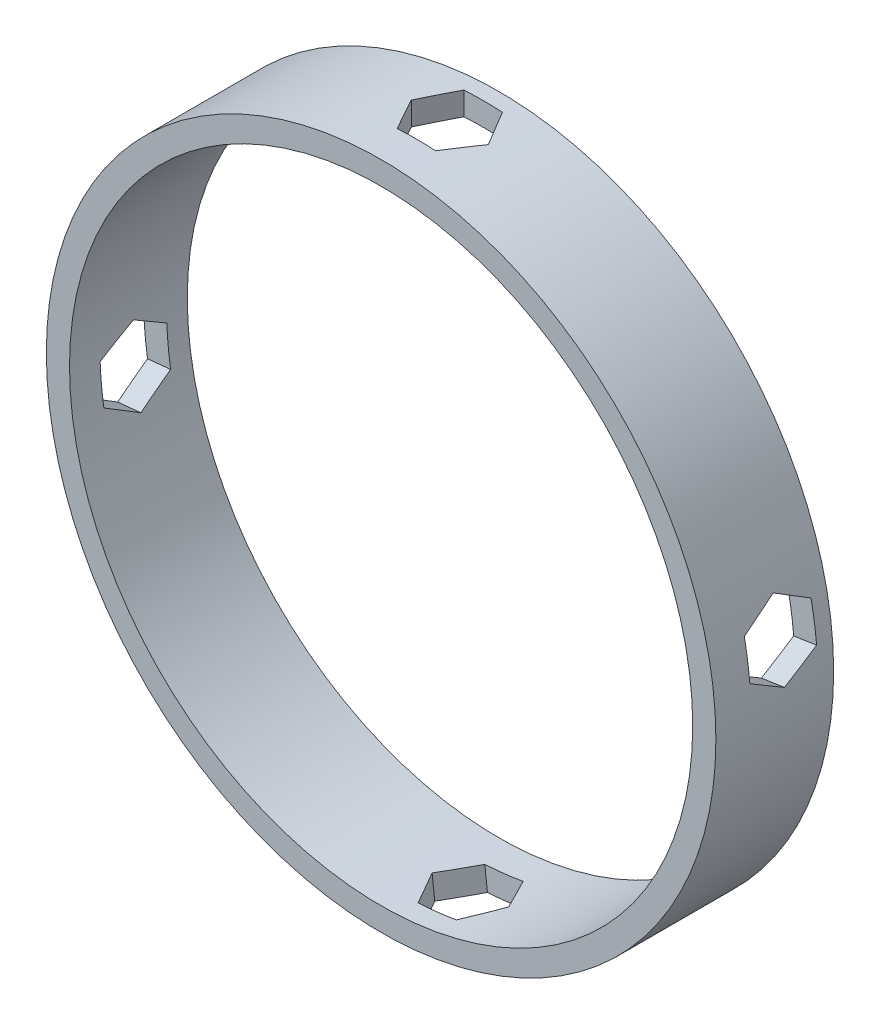
ISO-10303-21;
HEADER;
FILE_DESCRIPTION(('STEP AP214'),'2;1');
FILE_NAME('part.step','',(''),(''),'','','');
FILE_SCHEMA(('AUTOMOTIVE_DESIGN { 1 0 10303 214 1 1 1 1 }'));
ENDSEC;
DATA;
#1=APPLICATION_CONTEXT('core data for automotive mechanical design processes');
#2=APPLICATION_PROTOCOL_DEFINITION('international standard','automotive_design',2000,#1);
#3=PRODUCT_CONTEXT('',#1,'mechanical');
#4=PRODUCT('Part','Part','',(#3));
#5=PRODUCT_RELATED_PRODUCT_CATEGORY('part','',(#4));
#6=PRODUCT_DEFINITION_FORMATION('','',#4);
#7=PRODUCT_DEFINITION_CONTEXT('part definition',#1,'design');
#8=PRODUCT_DEFINITION('design','',#6,#7);
#9=PRODUCT_DEFINITION_SHAPE('','',#8);
#10=(LENGTH_UNIT() NAMED_UNIT(*) SI_UNIT(.MILLI.,.METRE.));
#11=(NAMED_UNIT(*) PLANE_ANGLE_UNIT() SI_UNIT($,.RADIAN.));
#12=(NAMED_UNIT(*) SI_UNIT($,.STERADIAN.) SOLID_ANGLE_UNIT());
#13=UNCERTAINTY_MEASURE_WITH_UNIT(LENGTH_MEASURE(1.E-05),#10,'distance_accuracy_value','');
#14=(GEOMETRIC_REPRESENTATION_CONTEXT(3) GLOBAL_UNCERTAINTY_ASSIGNED_CONTEXT((#13)) GLOBAL_UNIT_ASSIGNED_CONTEXT((#10,
#11,#12)) REPRESENTATION_CONTEXT('',''));
#15=CARTESIAN_POINT('',(0.,0.,0.));
#16=DIRECTION('',(0.,0.,1.));
#17=DIRECTION('',(1.,0.,0.));
#18=AXIS2_PLACEMENT_3D('',#15,#16,#17);
#19=CARTESIAN_POINT('',(0.,0.,12.));
#20=DIRECTION('',(0.,0.,1.));
#21=DIRECTION('',(1.,0.,0.));
#22=AXIS2_PLACEMENT_3D('',#19,#20,#21);
#23=PLANE('',#22);
#24=CARTESIAN_POINT('',(0.,0.,12.));
#25=DIRECTION('',(0.,0.,1.));
#26=DIRECTION('',(1.,0.,0.));
#27=AXIS2_PLACEMENT_3D('',#24,#25,#26);
#28=CIRCLE('',#27,34.11);
#29=CARTESIAN_POINT('',(34.11,0.,12.));
#30=VERTEX_POINT('',#29);
#31=EDGE_CURVE('E295',#30,#30,#28,.T.);
#32=ORIENTED_EDGE('',*,*,#31,.T.);
#33=EDGE_LOOP('',(#32));
#34=FACE_BOUND('',#33,.T.);
#35=CARTESIAN_POINT('',(0.,0.,12.));
#36=DIRECTION('',(0.,0.,1.));
#37=DIRECTION('',(1.,0.,0.));
#38=AXIS2_PLACEMENT_3D('',#35,#36,#37);
#39=CIRCLE('',#38,31.75);
#40=CARTESIAN_POINT('',(31.75,0.,12.));
#41=VERTEX_POINT('',#40);
#42=EDGE_CURVE('E289',#41,#41,#39,.T.);
#43=ORIENTED_EDGE('',*,*,#42,.F.);
#44=EDGE_LOOP('',(#43));
#45=FACE_BOUND('',#44,.T.);
#46=ADVANCED_FACE('F41',(#34,#45),#23,.T.);
#47=CARTESIAN_POINT('',(0.,0.,0.));
#48=DIRECTION('',(0.,0.,1.));
#49=DIRECTION('',(1.,0.,0.));
#50=AXIS2_PLACEMENT_3D('',#47,#48,#49);
#51=PLANE('',#50);
#52=CARTESIAN_POINT('',(0.,0.,0.));
#53=DIRECTION('',(0.,0.,1.));
#54=DIRECTION('',(1.,0.,0.));
#55=AXIS2_PLACEMENT_3D('',#52,#53,#54);
#56=CIRCLE('',#55,34.11);
#57=CARTESIAN_POINT('',(34.11,0.,0.));
#58=VERTEX_POINT('',#57);
#59=EDGE_CURVE('E292',#58,#58,#56,.T.);
#60=ORIENTED_EDGE('',*,*,#59,.F.);
#61=EDGE_LOOP('',(#60));
#62=FACE_BOUND('',#61,.T.);
#63=CARTESIAN_POINT('',(0.,0.,0.));
#64=DIRECTION('',(0.,0.,1.));
#65=DIRECTION('',(1.,0.,0.));
#66=AXIS2_PLACEMENT_3D('',#63,#64,#65);
#67=CIRCLE('',#66,31.75);
#68=CARTESIAN_POINT('',(31.75,0.,0.));
#69=VERTEX_POINT('',#68);
#70=EDGE_CURVE('E288',#69,#69,#67,.T.);
#71=ORIENTED_EDGE('',*,*,#70,.T.);
#72=EDGE_LOOP('',(#71));
#73=FACE_BOUND('',#72,.T.);
#74=ADVANCED_FACE('F417',(#62,#73),#51,.F.);
#75=CARTESIAN_POINT('',(0.,0.,12.));
#76=DIRECTION('',(0.,0.,-1.));
#77=DIRECTION('',(-1.,0.,0.));
#78=AXIS2_PLACEMENT_3D('',#75,#76,#77);
#79=CYLINDRICAL_SURFACE('',#78,34.11);
#80=CARTESIAN_POINT('',(0.,0.,-0.299999999999996));
#81=DIRECTION('',(0.860372586574934,0.0987877131548094,-0.5));
#82=DIRECTION('',(-0.496736344462413,-0.0570351127825568,-0.866025403784439));
#83=AXIS2_PLACEMENT_3D('',#80,#81,#82);
#84=ELLIPSE('',#83,68.22,34.11);
#85=CARTESIAN_POINT('',(7.76543265841478,-33.2143064902404,6.5));
#86=VERTEX_POINT('',#85);
#87=CARTESIAN_POINT('',(5.83466477935801,-33.6072728276562,3.1));
#88=VERTEX_POINT('',#87);
#89=EDGE_CURVE('E391',#86,#88,#84,.T.);
#90=ORIENTED_EDGE('',*,*,#89,.T.);
#91=CARTESIAN_POINT('',(0.,0.,3.1));
#92=DIRECTION('',(0.,0.,-1.));
#93=DIRECTION('',(-1.,0.,0.));
#94=AXIS2_PLACEMENT_3D('',#91,#92,#93);
#95=CIRCLE('',#94,34.11);
#96=CARTESIAN_POINT('',(1.93430905355165,-34.0551104606247,3.1));
#97=VERTEX_POINT('',#96);
#98=EDGE_CURVE('E393',#88,#97,#95,.T.);
#99=ORIENTED_EDGE('',*,*,#98,.T.);
#100=CARTESIAN_POINT('',(0.,0.,-0.299999999999991));
#101=DIRECTION('',(-0.860372586574934,-0.0987877131548094,-0.500000000000001));
#102=DIRECTION('',(0.496736344462414,0.0570351127825568,-0.866025403784438));
#103=AXIS2_PLACEMENT_3D('',#100,#101,#102);
#104=ELLIPSE('',#103,68.2199999999999,34.11);
#105=CARTESIAN_POINT('',(-0.0352787931979606,-34.1099817561773,6.5));
#106=VERTEX_POINT('',#105);
#107=EDGE_CURVE('E221',#97,#106,#104,.T.);
#108=ORIENTED_EDGE('',*,*,#107,.T.);
#109=CARTESIAN_POINT('',(0.,0.,13.3));
#110=DIRECTION('',(-0.860372586574934,-0.0987877131548094,0.5));
#111=DIRECTION('',(-0.496736344462413,-0.0570351127825568,-0.866025403784439));
#112=AXIS2_PLACEMENT_3D('',#109,#110,#111);
#113=ELLIPSE('',#112,68.22,34.11);
#114=CARTESIAN_POINT('',(1.93430905355164,-34.0551104606247,9.9));
#115=VERTEX_POINT('',#114);
#116=EDGE_CURVE('E45',#106,#115,#113,.T.);
#117=ORIENTED_EDGE('',*,*,#116,.T.);
#118=CARTESIAN_POINT('',(0.,0.,9.9));
#119=DIRECTION('',(0.,0.,1.));
#120=DIRECTION('',(1.,0.,0.));
#121=AXIS2_PLACEMENT_3D('',#118,#119,#120);
#122=CIRCLE('',#121,34.11);
#123=CARTESIAN_POINT('',(5.83466477935801,-33.6072728276562,9.9));
#124=VERTEX_POINT('',#123);
#125=EDGE_CURVE('E204',#115,#124,#122,.T.);
#126=ORIENTED_EDGE('',*,*,#125,.T.);
#127=CARTESIAN_POINT('',(0.,0.,13.3));
#128=DIRECTION('',(0.860372586574935,0.0987877131548094,0.5));
#129=DIRECTION('',(0.496736344462413,0.0570351127825567,-0.866025403784439));
#130=AXIS2_PLACEMENT_3D('',#127,#128,#129);
#131=ELLIPSE('',#130,68.22,34.11);
#132=EDGE_CURVE('E215',#124,#86,#131,.T.);
#133=ORIENTED_EDGE('',*,*,#132,.T.);
#134=EDGE_LOOP('',(#90,#99,#108,#117,#126,#133));
#135=FACE_BOUND('',#134,.T.);
#136=CARTESIAN_POINT('',(0.,0.,-1.8));
#137=DIRECTION('',(-0.126511613796825,0.856734971607044,-0.5));
#138=DIRECTION('',(0.0730415142812109,-0.494636166481493,-0.866025403784439));
#139=AXIS2_PLACEMENT_3D('',#136,#137,#138);
#140=ELLIPSE('',#139,68.22,34.11);
#141=CARTESIAN_POINT('',(32.946302839819,8.83364189827381,5.));
#142=VERTEX_POINT('',#141);
#143=CARTESIAN_POINT('',(33.4013952936952,6.91656652063103,1.6));
#144=VERTEX_POINT('',#143);
#145=EDGE_CURVE('E242',#142,#144,#140,.T.);
#146=ORIENTED_EDGE('',*,*,#145,.T.);
#147=CARTESIAN_POINT('',(0.,0.,1.6));
#148=DIRECTION('',(0.,0.,-1.));
#149=DIRECTION('',(-1.,0.,0.));
#150=AXIS2_PLACEMENT_3D('',#147,#148,#149);
#151=CIRCLE('',#150,34.11);
#152=CARTESIAN_POINT('',(33.9749146095742,3.03270131601243,1.6));
#153=VERTEX_POINT('',#152);
#154=EDGE_CURVE('E239',#144,#153,#151,.T.);
#155=ORIENTED_EDGE('',*,*,#154,.T.);
#156=CARTESIAN_POINT('',(0.,0.,-1.79999999999999));
#157=DIRECTION('',(0.126511613796825,-0.856734971607044,-0.500000000000001));
#158=DIRECTION('',(-0.073041514281211,0.494636166481494,-0.866025403784438));
#159=AXIS2_PLACEMENT_3D('',#156,#157,#158);
#160=ELLIPSE('',#159,68.2199999999999,34.11);
#161=CARTESIAN_POINT('',(34.0933414715768,1.06591148903661,5.));
#162=VERTEX_POINT('',#161);
#163=EDGE_CURVE('E236',#153,#162,#160,.T.);
#164=ORIENTED_EDGE('',*,*,#163,.T.);
#165=CARTESIAN_POINT('',(0.,0.,11.8));
#166=DIRECTION('',(0.126511613796825,-0.856734971607044,0.5));
#167=DIRECTION('',(0.0730415142812109,-0.494636166481494,-0.866025403784438));
#168=AXIS2_PLACEMENT_3D('',#165,#166,#167);
#169=ELLIPSE('',#168,68.22,34.11);
#170=CARTESIAN_POINT('',(33.9749146095742,3.03270131601242,8.4));
#171=VERTEX_POINT('',#170);
#172=EDGE_CURVE('E250',#162,#171,#169,.T.);
#173=ORIENTED_EDGE('',*,*,#172,.T.);
#174=CARTESIAN_POINT('',(0.,0.,8.4));
#175=DIRECTION('',(0.,0.,1.));
#176=DIRECTION('',(0.,-1.,0.));
#177=AXIS2_PLACEMENT_3D('',#174,#175,#176);
#178=CIRCLE('',#177,34.11);
#179=CARTESIAN_POINT('',(33.4013952936952,6.91656652063103,8.4));
#180=VERTEX_POINT('',#179);
#181=EDGE_CURVE('E248',#171,#180,#178,.T.);
#182=ORIENTED_EDGE('',*,*,#181,.T.);
#183=CARTESIAN_POINT('',(0.,0.,11.8));
#184=DIRECTION('',(-0.126511613796825,0.856734971607044,0.5));
#185=DIRECTION('',(-0.0730415142812109,0.494636166481493,-0.866025403784439));
#186=AXIS2_PLACEMENT_3D('',#183,#184,#185);
#187=ELLIPSE('',#186,68.22,34.11);
#188=EDGE_CURVE('E245',#180,#142,#187,.T.);
#189=ORIENTED_EDGE('',*,*,#188,.T.);
#190=EDGE_LOOP('',(#146,#155,#164,#173,#182,#189));
#191=FACE_BOUND('',#190,.T.);
#192=CARTESIAN_POINT('',(0.,0.,-1.3));
#193=DIRECTION('',(0.0845092701663769,-0.861892210926602,-0.5));
#194=DIRECTION('',(-0.0487914498795765,0.497613699990915,-0.866025403784439));
#195=AXIS2_PLACEMENT_3D('',#192,#193,#194);
#196=ELLIPSE('',#195,68.22,34.11);
#197=CARTESIAN_POINT('',(-33.3384908523083,-7.21367643373038,5.5));
#198=VERTEX_POINT('',#197);
#199=CARTESIAN_POINT('',(-33.699391297419,-5.27665861918705,2.1));
#200=VERTEX_POINT('',#199);
#201=EDGE_CURVE('E353',#198,#200,#196,.T.);
#202=ORIENTED_EDGE('',*,*,#201,.T.);
#203=CARTESIAN_POINT('',(0.,0.,2.1));
#204=DIRECTION('',(0.,0.,-1.));
#205=DIRECTION('',(-1.,0.,0.));
#206=AXIS2_PLACEMENT_3D('',#203,#204,#205);
#207=CIRCLE('',#206,34.11);
#208=CARTESIAN_POINT('',(-34.0824999888399,-1.36941392965312,2.1));
#209=VERTEX_POINT('',#208);
#210=EDGE_CURVE('E345',#200,#209,#207,.T.);
#211=ORIENTED_EDGE('',*,*,#210,.T.);
#212=CARTESIAN_POINT('',(0.,0.,-1.29999999999999));
#213=DIRECTION('',(-0.0845092701663769,0.861892210926602,-0.500000000000001));
#214=DIRECTION('',(0.0487914498795766,-0.497613699990916,-0.866025403784438));
#215=AXIS2_PLACEMENT_3D('',#212,#213,#214);
#216=ELLIPSE('',#215,68.2199999999999,34.11);
#217=CARTESIAN_POINT('',(-34.1047082351501,0.600812945337476,5.5));
#218=VERTEX_POINT('',#217);
#219=EDGE_CURVE('E330',#209,#218,#216,.T.);
#220=ORIENTED_EDGE('',*,*,#219,.T.);
#221=CARTESIAN_POINT('',(0.,0.,12.3));
#222=DIRECTION('',(-0.0845092701663769,0.861892210926602,0.5));
#223=DIRECTION('',(-0.0487914498795766,0.497613699990916,-0.866025403784439));
#224=AXIS2_PLACEMENT_3D('',#221,#222,#223);
#225=ELLIPSE('',#224,68.22,34.11);
#226=CARTESIAN_POINT('',(-34.0824999888399,-1.36941392965311,8.9));
#227=VERTEX_POINT('',#226);
#228=EDGE_CURVE('E272',#218,#227,#225,.T.);
#229=ORIENTED_EDGE('',*,*,#228,.T.);
#230=CARTESIAN_POINT('',(0.,0.,8.9));
#231=DIRECTION('',(0.,0.,1.));
#232=DIRECTION('',(0.,-1.,0.));
#233=AXIS2_PLACEMENT_3D('',#230,#231,#232);
#234=CIRCLE('',#233,34.11);
#235=CARTESIAN_POINT('',(-33.699391297419,-5.27665861918704,8.9));
#236=VERTEX_POINT('',#235);
#237=EDGE_CURVE('E348',#227,#236,#234,.T.);
#238=ORIENTED_EDGE('',*,*,#237,.T.);
#239=CARTESIAN_POINT('',(0.,0.,12.3));
#240=DIRECTION('',(0.0845092701663769,-0.861892210926602,0.5));
#241=DIRECTION('',(0.0487914498795765,-0.497613699990915,-0.866025403784439));
#242=AXIS2_PLACEMENT_3D('',#239,#240,#241);
#243=ELLIPSE('',#242,68.22,34.11);
#244=EDGE_CURVE('E350',#236,#198,#243,.T.);
#245=ORIENTED_EDGE('',*,*,#244,.T.);
#246=EDGE_LOOP('',(#202,#211,#220,#229,#238,#245));
#247=FACE_BOUND('',#246,.T.);
#248=CARTESIAN_POINT('',(0.,0.,-1.8));
#249=DIRECTION('',(-0.866025403784439,0.,-0.5));
#250=DIRECTION('',(0.5,0.,-0.866025403784439));
#251=AXIS2_PLACEMENT_3D('',#248,#249,#250);
#252=ELLIPSE('',#251,68.22,34.11);
#253=CARTESIAN_POINT('',(-3.92598183048945,33.8833110345885,5.));
#254=VERTEX_POINT('',#253);
#255=CARTESIAN_POINT('',(-1.96299091524473,34.053469231,1.6));
#256=VERTEX_POINT('',#255);
#257=EDGE_CURVE('E277',#254,#256,#252,.T.);
#258=ORIENTED_EDGE('',*,*,#257,.T.);
#259=CARTESIAN_POINT('',(0.,0.,1.6));
#260=DIRECTION('',(0.,0.,-1.));
#261=DIRECTION('',(-1.,0.,0.));
#262=AXIS2_PLACEMENT_3D('',#259,#260,#261);
#263=CIRCLE('',#262,34.11);
#264=CARTESIAN_POINT('',(1.96299091524472,34.0534692310001,1.6));
#265=VERTEX_POINT('',#264);
#266=EDGE_CURVE('E275',#256,#265,#263,.T.);
#267=ORIENTED_EDGE('',*,*,#266,.T.);
#268=CARTESIAN_POINT('',(0.,0.,-1.79999999999999));
#269=DIRECTION('',(0.866025403784438,0.,-0.500000000000001));
#270=DIRECTION('',(-0.500000000000001,0.,-0.866025403784438));
#271=AXIS2_PLACEMENT_3D('',#268,#269,#270);
#272=ELLIPSE('',#271,68.2199999999999,34.11);
#273=CARTESIAN_POINT('',(3.92598183048946,33.8833110345885,5.));
#274=VERTEX_POINT('',#273);
#275=EDGE_CURVE('E257',#265,#274,#272,.T.);
#276=ORIENTED_EDGE('',*,*,#275,.T.);
#277=CARTESIAN_POINT('',(0.,0.,11.8));
#278=DIRECTION('',(0.866025403784438,0.,0.5));
#279=DIRECTION('',(0.5,0.,-0.866025403784439));
#280=AXIS2_PLACEMENT_3D('',#277,#278,#279);
#281=ELLIPSE('',#280,68.22,34.11);
#282=CARTESIAN_POINT('',(1.96299091524473,34.053469231,8.4));
#283=VERTEX_POINT('',#282);
#284=EDGE_CURVE('E285',#274,#283,#281,.T.);
#285=ORIENTED_EDGE('',*,*,#284,.T.);
#286=CARTESIAN_POINT('',(0.,0.,8.4));
#287=DIRECTION('',(0.,0.,1.));
#288=DIRECTION('',(1.,0.,0.));
#289=AXIS2_PLACEMENT_3D('',#286,#287,#288);
#290=CIRCLE('',#289,34.11);
#291=CARTESIAN_POINT('',(-1.96299091524473,34.053469231,8.4));
#292=VERTEX_POINT('',#291);
#293=EDGE_CURVE('E283',#283,#292,#290,.T.);
#294=ORIENTED_EDGE('',*,*,#293,.T.);
#295=CARTESIAN_POINT('',(0.,0.,11.8));
#296=DIRECTION('',(-0.866025403784439,0.,0.5));
#297=DIRECTION('',(-0.5,0.,-0.866025403784439));
#298=AXIS2_PLACEMENT_3D('',#295,#296,#297);
#299=ELLIPSE('',#298,68.22,34.11);
#300=EDGE_CURVE('E280',#292,#254,#299,.T.);
#301=ORIENTED_EDGE('',*,*,#300,.T.);
#302=EDGE_LOOP('',(#258,#267,#276,#285,#294,#301));
#303=FACE_BOUND('',#302,.T.);
#304=ORIENTED_EDGE('',*,*,#31,.F.);
#305=EDGE_LOOP('',(#304));
#306=FACE_BOUND('',#305,.T.);
#307=ORIENTED_EDGE('',*,*,#59,.T.);
#308=EDGE_LOOP('',(#307));
#309=FACE_BOUND('',#308,.T.);
#310=ADVANCED_FACE('F224',(#135,#191,#247,#303,#306,#309),#79,.T.);
#311=CARTESIAN_POINT('',(0.,0.,12.));
#312=DIRECTION('',(0.,0.,-1.));
#313=DIRECTION('',(-1.,0.,0.));
#314=AXIS2_PLACEMENT_3D('',#311,#312,#313);
#315=CYLINDRICAL_SURFACE('',#314,31.75);
#316=CARTESIAN_POINT('',(0.,0.,13.3));
#317=DIRECTION('',(-0.860372586574934,-0.0987877131548094,0.5));
#318=DIRECTION('',(-0.496736344462413,-0.0570351127825568,-0.866025403784439));
#319=AXIS2_PLACEMENT_3D('',#316,#317,#318);
#320=ELLIPSE('',#319,63.5,31.75);
#321=CARTESIAN_POINT('',(-0.306420946643091,-31.7485213231019,6.5));
#322=VERTEX_POINT('',#321);
#323=CARTESIAN_POINT('',(1.66462311446839,-31.7063326464411,9.9));
#324=VERTEX_POINT('',#323);
#325=EDGE_CURVE('E12',#322,#324,#320,.T.);
#326=ORIENTED_EDGE('',*,*,#325,.F.);
#327=CARTESIAN_POINT('',(0.,0.,-0.299999999999991));
#328=DIRECTION('',(-0.860372586574934,-0.0987877131548094,-0.500000000000001));
#329=DIRECTION('',(0.496736344462414,0.0570351127825568,-0.866025403784438));
#330=AXIS2_PLACEMENT_3D('',#327,#328,#329);
#331=ELLIPSE('',#330,63.4999999999999,31.75);
#332=CARTESIAN_POINT('',(1.6646231144684,-31.7063326464411,3.1));
#333=VERTEX_POINT('',#332);
#334=EDGE_CURVE('E368',#333,#322,#331,.T.);
#335=ORIENTED_EDGE('',*,*,#334,.F.);
#336=CARTESIAN_POINT('',(0.,0.,3.1));
#337=DIRECTION('',(0.,0.,-1.));
#338=DIRECTION('',(-1.,0.,0.));
#339=AXIS2_PLACEMENT_3D('',#336,#337,#338);
#340=CIRCLE('',#339,31.75);
#341=CARTESIAN_POINT('',(5.56497884027476,-31.2584950134726,3.1));
#342=VERTEX_POINT('',#341);
#343=EDGE_CURVE('E384',#342,#333,#340,.T.);
#344=ORIENTED_EDGE('',*,*,#343,.F.);
#345=CARTESIAN_POINT('',(0.,0.,-0.299999999999996));
#346=DIRECTION('',(0.860372586574934,0.0987877131548094,-0.5));
#347=DIRECTION('',(-0.496736344462413,-0.0570351127825568,-0.866025403784439));
#348=AXIS2_PLACEMENT_3D('',#345,#346,#347);
#349=ELLIPSE('',#348,63.5,31.75);
#350=CARTESIAN_POINT('',(7.49429050496965,-30.852846057165,6.5));
#351=VERTEX_POINT('',#350);
#352=EDGE_CURVE('E387',#351,#342,#349,.T.);
#353=ORIENTED_EDGE('',*,*,#352,.F.);
#354=CARTESIAN_POINT('',(0.,0.,13.3));
#355=DIRECTION('',(0.860372586574935,0.0987877131548094,0.5));
#356=DIRECTION('',(0.496736344462413,0.0570351127825567,-0.866025403784439));
#357=AXIS2_PLACEMENT_3D('',#354,#355,#356);
#358=ELLIPSE('',#357,63.5,31.75);
#359=CARTESIAN_POINT('',(5.56497884027476,-31.2584950134726,9.9));
#360=VERTEX_POINT('',#359);
#361=EDGE_CURVE('E381',#360,#351,#358,.T.);
#362=ORIENTED_EDGE('',*,*,#361,.F.);
#363=CARTESIAN_POINT('',(0.,0.,9.9));
#364=DIRECTION('',(0.,0.,1.));
#365=DIRECTION('',(1.,0.,0.));
#366=AXIS2_PLACEMENT_3D('',#363,#364,#365);
#367=CIRCLE('',#366,31.75);
#368=EDGE_CURVE('E51',#324,#360,#367,.T.);
#369=ORIENTED_EDGE('',*,*,#368,.F.);
#370=EDGE_LOOP('',(#326,#335,#344,#353,#362,#369));
#371=FACE_BOUND('',#370,.T.);
#372=CARTESIAN_POINT('',(0.,0.,11.8));
#373=DIRECTION('',(0.126511613796825,-0.856734971607044,0.5));
#374=DIRECTION('',(0.0730415142812109,-0.494636166481494,-0.866025403784438));
#375=AXIS2_PLACEMENT_3D('',#372,#373,#374);
#376=ELLIPSE('',#375,63.5,31.75);
#377=CARTESIAN_POINT('',(31.741865182524,0.718675681007178,5.));
#378=VERTEX_POINT('',#377);
#379=CARTESIAN_POINT('',(31.636067317895,2.68733039606545,8.4));
#380=VERTEX_POINT('',#379);
#381=EDGE_CURVE('E367',#378,#380,#376,.T.);
#382=ORIENTED_EDGE('',*,*,#381,.F.);
#383=CARTESIAN_POINT('',(0.,0.,-1.79999999999999));
#384=DIRECTION('',(0.126511613796825,-0.856734971607044,-0.500000000000001));
#385=DIRECTION('',(-0.073041514281211,0.494636166481494,-0.866025403784438));
#386=AXIS2_PLACEMENT_3D('',#383,#384,#385);
#387=ELLIPSE('',#386,63.4999999999999,31.75);
#388=CARTESIAN_POINT('',(31.636067317895,2.68733039606546,1.6));
#389=VERTEX_POINT('',#388);
#390=EDGE_CURVE('E198',#389,#378,#387,.T.);
#391=ORIENTED_EDGE('',*,*,#390,.F.);
#392=CARTESIAN_POINT('',(0.,0.,1.6));
#393=DIRECTION('',(0.,0.,-1.));
#394=DIRECTION('',(-1.,0.,0.));
#395=AXIS2_PLACEMENT_3D('',#392,#393,#394);
#396=CIRCLE('',#395,31.75);
#397=CARTESIAN_POINT('',(31.062548002016,6.57119560068405,1.6));
#398=VERTEX_POINT('',#397);
#399=EDGE_CURVE('E358',#398,#389,#396,.T.);
#400=ORIENTED_EDGE('',*,*,#399,.F.);
#401=CARTESIAN_POINT('',(0.,0.,-1.8));
#402=DIRECTION('',(-0.126511613796825,0.856734971607044,-0.5));
#403=DIRECTION('',(0.0730415142812109,-0.494636166481493,-0.866025403784439));
#404=AXIS2_PLACEMENT_3D('',#401,#402,#403);
#405=ELLIPSE('',#404,63.5,31.75);
#406=CARTESIAN_POINT('',(30.5948265507661,8.48640609024438,5.));
#407=VERTEX_POINT('',#406);
#408=EDGE_CURVE('E361',#407,#398,#405,.T.);
#409=ORIENTED_EDGE('',*,*,#408,.F.);
#410=CARTESIAN_POINT('',(0.,0.,11.8));
#411=DIRECTION('',(-0.126511613796825,0.856734971607044,0.5));
#412=DIRECTION('',(-0.0730415142812109,0.494636166481493,-0.866025403784439));
#413=AXIS2_PLACEMENT_3D('',#410,#411,#412);
#414=ELLIPSE('',#413,63.5,31.75);
#415=CARTESIAN_POINT('',(31.0625480020161,6.57119560068406,8.4));
#416=VERTEX_POINT('',#415);
#417=EDGE_CURVE('E363',#416,#407,#414,.T.);
#418=ORIENTED_EDGE('',*,*,#417,.F.);
#419=CARTESIAN_POINT('',(0.,0.,8.4));
#420=DIRECTION('',(0.,0.,1.));
#421=DIRECTION('',(0.,-1.,0.));
#422=AXIS2_PLACEMENT_3D('',#419,#420,#421);
#423=CIRCLE('',#422,31.75);
#424=EDGE_CURVE('E365',#380,#416,#423,.T.);
#425=ORIENTED_EDGE('',*,*,#424,.F.);
#426=EDGE_LOOP('',(#382,#391,#400,#409,#418,#425));
#427=FACE_BOUND('',#426,.T.);
#428=CARTESIAN_POINT('',(0.,0.,12.3));
#429=DIRECTION('',(-0.0845092701663769,0.861892210926602,0.5));
#430=DIRECTION('',(-0.0487914498795766,0.497613699990916,-0.866025403784439));
#431=AXIS2_PLACEMENT_3D('',#428,#429,#430);
#432=ELLIPSE('',#431,63.5,31.75);
#433=CARTESIAN_POINT('',(-31.7390768965442,0.832765126101893,5.5));
#434=VERTEX_POINT('',#433);
#435=CARTESIAN_POINT('',(-31.7295736696728,-1.13870748693646,8.9));
#436=VERTEX_POINT('',#435);
#437=EDGE_CURVE('E341',#434,#436,#432,.T.);
#438=ORIENTED_EDGE('',*,*,#437,.F.);
#439=CARTESIAN_POINT('',(0.,0.,-1.29999999999999));
#440=DIRECTION('',(-0.0845092701663769,0.861892210926602,-0.500000000000001));
#441=DIRECTION('',(0.0487914498795766,-0.497613699990916,-0.866025403784438));
#442=AXIS2_PLACEMENT_3D('',#439,#440,#441);
#443=ELLIPSE('',#442,63.4999999999999,31.75);
#444=CARTESIAN_POINT('',(-31.7295736696728,-1.13870748693646,2.1));
#445=VERTEX_POINT('',#444);
#446=EDGE_CURVE('E313',#445,#434,#443,.T.);
#447=ORIENTED_EDGE('',*,*,#446,.F.);
#448=CARTESIAN_POINT('',(0.,0.,2.1));
#449=DIRECTION('',(0.,0.,-1.));
#450=DIRECTION('',(-1.,0.,0.));
#451=AXIS2_PLACEMENT_3D('',#448,#449,#450);
#452=CIRCLE('',#451,31.75);
#453=CARTESIAN_POINT('',(-31.3464649782519,-5.04595217647039,2.1));
#454=VERTEX_POINT('',#453);
#455=EDGE_CURVE('E332',#454,#445,#452,.T.);
#456=ORIENTED_EDGE('',*,*,#455,.F.);
#457=CARTESIAN_POINT('',(0.,0.,-1.3));
#458=DIRECTION('',(0.0845092701663769,-0.861892210926602,-0.5));
#459=DIRECTION('',(-0.0487914498795765,0.497613699990915,-0.866025403784439));
#460=AXIS2_PLACEMENT_3D('',#457,#458,#459);
#461=ELLIPSE('',#460,63.5,31.75);
#462=CARTESIAN_POINT('',(-30.9728595137024,-6.98172425296597,5.5));
#463=VERTEX_POINT('',#462);
#464=EDGE_CURVE('E335',#463,#454,#461,.T.);
#465=ORIENTED_EDGE('',*,*,#464,.F.);
#466=CARTESIAN_POINT('',(0.,0.,12.3));
#467=DIRECTION('',(0.0845092701663769,-0.861892210926602,0.5));
#468=DIRECTION('',(0.0487914498795765,-0.497613699990915,-0.866025403784439));
#469=AXIS2_PLACEMENT_3D('',#466,#467,#468);
#470=ELLIPSE('',#469,63.5,31.75);
#471=CARTESIAN_POINT('',(-31.3464649782519,-5.04595217647039,8.9));
#472=VERTEX_POINT('',#471);
#473=EDGE_CURVE('E337',#472,#463,#470,.T.);
#474=ORIENTED_EDGE('',*,*,#473,.F.);
#475=CARTESIAN_POINT('',(0.,0.,8.9));
#476=DIRECTION('',(0.,0.,1.));
#477=DIRECTION('',(0.,-1.,0.));
#478=AXIS2_PLACEMENT_3D('',#475,#476,#477);
#479=CIRCLE('',#478,31.75);
#480=EDGE_CURVE('E339',#436,#472,#479,.T.);
#481=ORIENTED_EDGE('',*,*,#480,.F.);
#482=EDGE_LOOP('',(#438,#447,#456,#465,#474,#481));
#483=FACE_BOUND('',#482,.T.);
#484=CARTESIAN_POINT('',(0.,0.,11.8));
#485=DIRECTION('',(0.866025403784438,0.,0.5));
#486=DIRECTION('',(0.5,0.,-0.866025403784439));
#487=AXIS2_PLACEMENT_3D('',#484,#485,#486);
#488=ELLIPSE('',#487,63.5,31.75);
#489=CARTESIAN_POINT('',(3.92598183048946,31.5063353417478,5.));
#490=VERTEX_POINT('',#489);
#491=CARTESIAN_POINT('',(1.96299091524473,31.6892594843532,8.4));
#492=VERTEX_POINT('',#491);
#493=EDGE_CURVE('E311',#490,#492,#488,.T.);
#494=ORIENTED_EDGE('',*,*,#493,.F.);
#495=CARTESIAN_POINT('',(0.,0.,-1.79999999999999));
#496=DIRECTION('',(0.866025403784438,0.,-0.500000000000001));
#497=DIRECTION('',(-0.500000000000001,0.,-0.866025403784438));
#498=AXIS2_PLACEMENT_3D('',#495,#496,#497);
#499=ELLIPSE('',#498,63.4999999999999,31.75);
#500=CARTESIAN_POINT('',(1.96299091524472,31.6892594843532,1.6));
#501=VERTEX_POINT('',#500);
#502=EDGE_CURVE('E298',#501,#490,#499,.T.);
#503=ORIENTED_EDGE('',*,*,#502,.F.);
#504=CARTESIAN_POINT('',(0.,0.,1.6));
#505=DIRECTION('',(0.,0.,-1.));
#506=DIRECTION('',(-1.,0.,0.));
#507=AXIS2_PLACEMENT_3D('',#504,#505,#506);
#508=CIRCLE('',#507,31.75);
#509=CARTESIAN_POINT('',(-1.96299091524473,31.6892594843532,1.6));
#510=VERTEX_POINT('',#509);
#511=EDGE_CURVE('E302',#510,#501,#508,.T.);
#512=ORIENTED_EDGE('',*,*,#511,.F.);
#513=CARTESIAN_POINT('',(0.,0.,-1.8));
#514=DIRECTION('',(-0.866025403784439,0.,-0.5));
#515=DIRECTION('',(0.5,0.,-0.866025403784439));
#516=AXIS2_PLACEMENT_3D('',#513,#514,#515);
#517=ELLIPSE('',#516,63.5,31.75);
#518=CARTESIAN_POINT('',(-3.92598183048945,31.5063353417478,5.));
#519=VERTEX_POINT('',#518);
#520=EDGE_CURVE('E305',#519,#510,#517,.T.);
#521=ORIENTED_EDGE('',*,*,#520,.F.);
#522=CARTESIAN_POINT('',(0.,0.,11.8));
#523=DIRECTION('',(-0.866025403784439,0.,0.5));
#524=DIRECTION('',(-0.5,0.,-0.866025403784439));
#525=AXIS2_PLACEMENT_3D('',#522,#523,#524);
#526=ELLIPSE('',#525,63.5,31.75);
#527=CARTESIAN_POINT('',(-1.96299091524473,31.6892594843532,8.4));
#528=VERTEX_POINT('',#527);
#529=EDGE_CURVE('E307',#528,#519,#526,.T.);
#530=ORIENTED_EDGE('',*,*,#529,.F.);
#531=CARTESIAN_POINT('',(0.,0.,8.4));
#532=DIRECTION('',(0.,0.,1.));
#533=DIRECTION('',(1.,0.,0.));
#534=AXIS2_PLACEMENT_3D('',#531,#532,#533);
#535=CIRCLE('',#534,31.75);
#536=EDGE_CURVE('E309',#492,#528,#535,.T.);
#537=ORIENTED_EDGE('',*,*,#536,.F.);
#538=EDGE_LOOP('',(#494,#503,#512,#521,#530,#537));
#539=FACE_BOUND('',#538,.T.);
#540=ORIENTED_EDGE('',*,*,#42,.T.);
#541=EDGE_LOOP('',(#540));
#542=FACE_BOUND('',#541,.T.);
#543=ORIENTED_EDGE('',*,*,#70,.F.);
#544=EDGE_LOOP('',(#543));
#545=FACE_BOUND('',#544,.T.);
#546=ADVANCED_FACE('F402',(#371,#427,#483,#539,#542,#545),#315,.F.);
#547=CARTESIAN_POINT('',(1.96299091524473,24.11,8.4));
#548=DIRECTION('',(0.866025403784438,0.,0.5));
#549=DIRECTION('',(0.5,0.,-0.866025403784439));
#550=AXIS2_PLACEMENT_3D('',#547,#548,#549);
#551=PLANE('',#550);
#552=DIRECTION('',(0.,1.,0.));
#553=VECTOR('',#552,1.);
#554=CARTESIAN_POINT('',(3.92598183048946,24.11,5.));
#555=LINE('',#554,#553);
#556=EDGE_CURVE('E270',#490,#274,#555,.T.);
#557=ORIENTED_EDGE('',*,*,#556,.F.);
#558=ORIENTED_EDGE('',*,*,#493,.T.);
#559=DIRECTION('',(0.,1.,0.));
#560=VECTOR('',#559,1.);
#561=CARTESIAN_POINT('',(1.96299091524473,24.11,8.4));
#562=LINE('',#561,#560);
#563=EDGE_CURVE('E254',#492,#283,#562,.T.);
#564=ORIENTED_EDGE('',*,*,#563,.T.);
#565=ORIENTED_EDGE('',*,*,#284,.F.);
#566=EDGE_LOOP('',(#557,#558,#564,#565));
#567=FACE_BOUND('',#566,.T.);
#568=ADVANCED_FACE('F484',(#567),#551,.F.);
#569=CARTESIAN_POINT('',(-1.96299091524473,24.11,8.4));
#570=DIRECTION('',(0.,0.,1.));
#571=DIRECTION('',(1.,0.,0.));
#572=AXIS2_PLACEMENT_3D('',#569,#570,#571);
#573=PLANE('',#572);
#574=ORIENTED_EDGE('',*,*,#563,.F.);
#575=ORIENTED_EDGE('',*,*,#536,.T.);
#576=DIRECTION('',(0.,1.,0.));
#577=VECTOR('',#576,1.);
#578=CARTESIAN_POINT('',(-1.96299091524473,24.11,8.4));
#579=LINE('',#578,#577);
#580=EDGE_CURVE('E258',#528,#292,#579,.T.);
#581=ORIENTED_EDGE('',*,*,#580,.T.);
#582=ORIENTED_EDGE('',*,*,#293,.F.);
#583=EDGE_LOOP('',(#574,#575,#581,#582));
#584=FACE_BOUND('',#583,.T.);
#585=ADVANCED_FACE('F480',(#584),#573,.F.);
#586=CARTESIAN_POINT('',(-3.92598183048945,24.11,5.));
#587=DIRECTION('',(-0.866025403784439,0.,0.5));
#588=DIRECTION('',(0.5,0.,0.866025403784439));
#589=AXIS2_PLACEMENT_3D('',#586,#587,#588);
#590=PLANE('',#589);
#591=ORIENTED_EDGE('',*,*,#580,.F.);
#592=ORIENTED_EDGE('',*,*,#529,.T.);
#593=DIRECTION('',(0.,1.,0.));
#594=VECTOR('',#593,1.);
#595=CARTESIAN_POINT('',(-3.92598183048945,24.11,5.));
#596=LINE('',#595,#594);
#597=EDGE_CURVE('E261',#519,#254,#596,.T.);
#598=ORIENTED_EDGE('',*,*,#597,.T.);
#599=ORIENTED_EDGE('',*,*,#300,.F.);
#600=EDGE_LOOP('',(#591,#592,#598,#599));
#601=FACE_BOUND('',#600,.T.);
#602=ADVANCED_FACE('F483',(#601),#590,.F.);
#603=CARTESIAN_POINT('',(-1.96299091524473,24.11,1.6));
#604=DIRECTION('',(-0.866025403784439,0.,-0.5));
#605=DIRECTION('',(-0.5,0.,0.866025403784439));
#606=AXIS2_PLACEMENT_3D('',#603,#604,#605);
#607=PLANE('',#606);
#608=ORIENTED_EDGE('',*,*,#597,.F.);
#609=ORIENTED_EDGE('',*,*,#520,.T.);
#610=DIRECTION('',(0.,1.,0.));
#611=VECTOR('',#610,1.);
#612=CARTESIAN_POINT('',(-1.96299091524473,24.11,1.6));
#613=LINE('',#612,#611);
#614=EDGE_CURVE('E264',#510,#256,#613,.T.);
#615=ORIENTED_EDGE('',*,*,#614,.T.);
#616=ORIENTED_EDGE('',*,*,#257,.F.);
#617=EDGE_LOOP('',(#608,#609,#615,#616));
#618=FACE_BOUND('',#617,.T.);
#619=ADVANCED_FACE('F488',(#618),#607,.F.);
#620=CARTESIAN_POINT('',(1.96299091524472,24.11,1.6));
#621=DIRECTION('',(0.,0.,-1.));
#622=DIRECTION('',(-1.,0.,0.));
#623=AXIS2_PLACEMENT_3D('',#620,#621,#622);
#624=PLANE('',#623);
#625=ORIENTED_EDGE('',*,*,#614,.F.);
#626=ORIENTED_EDGE('',*,*,#511,.T.);
#627=DIRECTION('',(0.,1.,0.));
#628=VECTOR('',#627,1.);
#629=CARTESIAN_POINT('',(1.96299091524472,24.11,1.6));
#630=LINE('',#629,#628);
#631=EDGE_CURVE('E267',#501,#265,#630,.T.);
#632=ORIENTED_EDGE('',*,*,#631,.T.);
#633=ORIENTED_EDGE('',*,*,#266,.F.);
#634=EDGE_LOOP('',(#625,#626,#632,#633));
#635=FACE_BOUND('',#634,.T.);
#636=ADVANCED_FACE('F492',(#635),#624,.F.);
#637=CARTESIAN_POINT('',(3.92598183048946,24.11,5.));
#638=DIRECTION('',(0.866025403784438,0.,-0.500000000000001));
#639=DIRECTION('',(-0.500000000000001,0.,-0.866025403784438));
#640=AXIS2_PLACEMENT_3D('',#637,#638,#639);
#641=PLANE('',#640);
#642=ORIENTED_EDGE('',*,*,#631,.F.);
#643=ORIENTED_EDGE('',*,*,#502,.T.);
#644=ORIENTED_EDGE('',*,*,#556,.T.);
#645=ORIENTED_EDGE('',*,*,#275,.F.);
#646=EDGE_LOOP('',(#642,#643,#644,#645));
#647=FACE_BOUND('',#646,.T.);
#648=ADVANCED_FACE('F445',(#647),#641,.F.);
#649=CARTESIAN_POINT('',(-24.1864869592724,-0.399101368426213,8.9));
#650=DIRECTION('',(-0.0845092701663769,0.861892210926602,0.5));
#651=DIRECTION('',(0.,-0.50179507500149,0.864986533250229));
#652=AXIS2_PLACEMENT_3D('',#649,#650,#651);
#653=PLANE('',#652);
#654=DIRECTION('',(-0.995227399981831,-0.0975828997591531,0.));
#655=VECTOR('',#654,1.);
#656=CARTESIAN_POINT('',(-24.3780413049828,1.55452097634075,5.5));
#657=LINE('',#656,#655);
#658=EDGE_CURVE('E253',#434,#218,#657,.T.);
#659=ORIENTED_EDGE('',*,*,#658,.F.);
#660=ORIENTED_EDGE('',*,*,#437,.T.);
#661=DIRECTION('',(-0.995227399981831,-0.0975828997591531,0.));
#662=VECTOR('',#661,1.);
#663=CARTESIAN_POINT('',(-24.1864869592724,-0.399101368426213,8.9));
#664=LINE('',#663,#662);
#665=EDGE_CURVE('E327',#436,#227,#664,.T.);
#666=ORIENTED_EDGE('',*,*,#665,.T.);
#667=ORIENTED_EDGE('',*,*,#228,.F.);
#668=EDGE_LOOP('',(#659,#660,#666,#667));
#669=FACE_BOUND('',#668,.T.);
#670=ADVANCED_FACE('F441',(#669),#653,.F.);
#671=CARTESIAN_POINT('',(-23.8033782678515,-4.30634605796014,8.9));
#672=DIRECTION('',(0.,0.,1.));
#673=DIRECTION('',(0.,-1.,0.));
#674=AXIS2_PLACEMENT_3D('',#671,#672,#673);
#675=PLANE('',#674);
#676=ORIENTED_EDGE('',*,*,#665,.F.);
#677=ORIENTED_EDGE('',*,*,#480,.T.);
#678=DIRECTION('',(-0.995227399981831,-0.0975828997591531,0.));
#679=VECTOR('',#678,1.);
#680=CARTESIAN_POINT('',(-23.8033782678515,-4.30634605796014,8.9));
#681=LINE('',#680,#679);
#682=EDGE_CURVE('E324',#472,#236,#681,.T.);
#683=ORIENTED_EDGE('',*,*,#682,.T.);
#684=ORIENTED_EDGE('',*,*,#237,.F.);
#685=EDGE_LOOP('',(#676,#677,#683,#684));
#686=FACE_BOUND('',#685,.T.);
#687=ADVANCED_FACE('F444',(#686),#675,.F.);
#688=CARTESIAN_POINT('',(-23.611823922141,-6.25996840272711,5.5));
#689=DIRECTION('',(0.0845092701663769,-0.861892210926602,0.5));
#690=DIRECTION('',(0.,-0.50179507500149,-0.864986533250229));
#691=AXIS2_PLACEMENT_3D('',#688,#689,#690);
#692=PLANE('',#691);
#693=ORIENTED_EDGE('',*,*,#682,.F.);
#694=ORIENTED_EDGE('',*,*,#473,.T.);
#695=DIRECTION('',(-0.995227399981831,-0.0975828997591531,0.));
#696=VECTOR('',#695,1.);
#697=CARTESIAN_POINT('',(-23.611823922141,-6.25996840272711,5.5));
#698=LINE('',#697,#696);
#699=EDGE_CURVE('E321',#463,#198,#698,.T.);
#700=ORIENTED_EDGE('',*,*,#699,.T.);
#701=ORIENTED_EDGE('',*,*,#244,.F.);
#702=EDGE_LOOP('',(#693,#694,#700,#701));
#703=FACE_BOUND('',#702,.T.);
#704=ADVANCED_FACE('F449',(#703),#692,.F.);
#705=CARTESIAN_POINT('',(-23.8033782678515,-4.30634605796014,2.1));
#706=DIRECTION('',(0.0845092701663769,-0.861892210926602,-0.5));
#707=DIRECTION('',(0.,0.50179507500149,-0.864986533250229));
#708=AXIS2_PLACEMENT_3D('',#705,#706,#707);
#709=PLANE('',#708);
#710=ORIENTED_EDGE('',*,*,#699,.F.);
#711=ORIENTED_EDGE('',*,*,#464,.T.);
#712=DIRECTION('',(-0.995227399981831,-0.0975828997591531,0.));
#713=VECTOR('',#712,1.);
#714=CARTESIAN_POINT('',(-23.8033782678515,-4.30634605796014,2.1));
#715=LINE('',#714,#713);
#716=EDGE_CURVE('E317',#454,#200,#715,.T.);
#717=ORIENTED_EDGE('',*,*,#716,.T.);
#718=ORIENTED_EDGE('',*,*,#201,.F.);
#719=EDGE_LOOP('',(#710,#711,#717,#718));
#720=FACE_BOUND('',#719,.T.);
#721=ADVANCED_FACE('F439',(#720),#709,.F.);
#722=CARTESIAN_POINT('',(-24.1864869592724,-0.399101368426219,2.1));
#723=DIRECTION('',(0.,0.,-1.));
#724=DIRECTION('',(-1.,0.,0.));
#725=AXIS2_PLACEMENT_3D('',#722,#723,#724);
#726=PLANE('',#725);
#727=ORIENTED_EDGE('',*,*,#716,.F.);
#728=ORIENTED_EDGE('',*,*,#455,.T.);
#729=DIRECTION('',(-0.995227399981831,-0.0975828997591531,0.));
#730=VECTOR('',#729,1.);
#731=CARTESIAN_POINT('',(-24.1864869592724,-0.399101368426219,2.1));
#732=LINE('',#731,#730);
#733=EDGE_CURVE('E314',#445,#209,#732,.T.);
#734=ORIENTED_EDGE('',*,*,#733,.T.);
#735=ORIENTED_EDGE('',*,*,#210,.F.);
#736=EDGE_LOOP('',(#727,#728,#734,#735));
#737=FACE_BOUND('',#736,.T.);
#738=ADVANCED_FACE('F435',(#737),#726,.F.);
#739=CARTESIAN_POINT('',(-24.3780413049828,1.55452097634075,5.5));
#740=DIRECTION('',(-0.0845092701663769,0.861892210926602,-0.500000000000001));
#741=DIRECTION('',(0.,0.501795075001491,0.864986533250228));
#742=AXIS2_PLACEMENT_3D('',#739,#740,#741);
#743=PLANE('',#742);
#744=ORIENTED_EDGE('',*,*,#733,.F.);
#745=ORIENTED_EDGE('',*,*,#446,.T.);
#746=ORIENTED_EDGE('',*,*,#658,.T.);
#747=ORIENTED_EDGE('',*,*,#219,.F.);
#748=EDGE_LOOP('',(#744,#745,#746,#747));
#749=FACE_BOUND('',#748,.T.);
#750=ADVANCED_FACE('F431',(#749),#743,.F.);
#751=CARTESIAN_POINT('',(24.1381156056771,1.58012921633068,8.4));
#752=DIRECTION('',(0.126511613796825,-0.856734971607044,0.5));
#753=DIRECTION('',(0.,-0.504049977967569,-0.863674487125152));
#754=AXIS2_PLACEMENT_3D('',#751,#752,#753);
#755=PLANE('',#754);
#756=DIRECTION('',(0.989272332962987,0.146083028562422,0.));
#757=VECTOR('',#756,1.);
#758=CARTESIAN_POINT('',(24.4248752636166,-0.361803385978615,5.));
#759=LINE('',#758,#757);
#760=EDGE_CURVE('E226',#378,#162,#759,.T.);
#761=ORIENTED_EDGE('',*,*,#760,.F.);
#762=ORIENTED_EDGE('',*,*,#381,.T.);
#763=DIRECTION('',(0.989272332962987,0.146083028562422,0.));
#764=VECTOR('',#763,1.);
#765=CARTESIAN_POINT('',(24.1381156056771,1.58012921633068,8.4));
#766=LINE('',#765,#764);
#767=EDGE_CURVE('E240',#380,#171,#766,.T.);
#768=ORIENTED_EDGE('',*,*,#767,.T.);
#769=ORIENTED_EDGE('',*,*,#172,.F.);
#770=EDGE_LOOP('',(#761,#762,#768,#769));
#771=FACE_BOUND('',#770,.T.);
#772=ADVANCED_FACE('F434',(#771),#755,.F.);
#773=CARTESIAN_POINT('',(23.5645962897981,5.46399442094929,8.4));
#774=DIRECTION('',(0.,0.,1.));
#775=DIRECTION('',(0.,-1.,0.));
#776=AXIS2_PLACEMENT_3D('',#773,#774,#775);
#777=PLANE('',#776);
#778=ORIENTED_EDGE('',*,*,#767,.F.);
#779=ORIENTED_EDGE('',*,*,#424,.T.);
#780=DIRECTION('',(0.989272332962987,0.146083028562422,0.));
#781=VECTOR('',#780,1.);
#782=CARTESIAN_POINT('',(23.5645962897981,5.46399442094929,8.4));
#783=LINE('',#782,#781);
#784=EDGE_CURVE('E702',#416,#180,#783,.T.);
#785=ORIENTED_EDGE('',*,*,#784,.T.);
#786=ORIENTED_EDGE('',*,*,#181,.F.);
#787=EDGE_LOOP('',(#778,#779,#785,#786));
#788=FACE_BOUND('',#787,.T.);
#789=ADVANCED_FACE('F478',(#788),#777,.F.);
#790=CARTESIAN_POINT('',(23.2778366318587,7.40592702325859,5.));
#791=DIRECTION('',(-0.126511613796825,0.856734971607044,0.5));
#792=DIRECTION('',(0.,-0.504049977967568,0.863674487125152));
#793=AXIS2_PLACEMENT_3D('',#790,#791,#792);
#794=PLANE('',#793);
#795=ORIENTED_EDGE('',*,*,#784,.F.);
#796=ORIENTED_EDGE('',*,*,#417,.T.);
#797=DIRECTION('',(0.989272332962987,0.146083028562422,0.));
#798=VECTOR('',#797,1.);
#799=CARTESIAN_POINT('',(23.2778366318587,7.40592702325859,5.));
#800=LINE('',#799,#798);
#801=EDGE_CURVE('E697',#407,#142,#800,.T.);
#802=ORIENTED_EDGE('',*,*,#801,.T.);
#803=ORIENTED_EDGE('',*,*,#188,.F.);
#804=EDGE_LOOP('',(#795,#796,#802,#803));
#805=FACE_BOUND('',#804,.T.);
#806=ADVANCED_FACE('F619',(#805),#794,.F.);
#807=CARTESIAN_POINT('',(23.5645962897981,5.46399442094929,1.6));
#808=DIRECTION('',(-0.126511613796825,0.856734971607044,-0.5));
#809=DIRECTION('',(0.,0.504049977967568,0.863674487125152));
#810=AXIS2_PLACEMENT_3D('',#807,#808,#809);
#811=PLANE('',#810);
#812=ORIENTED_EDGE('',*,*,#801,.F.);
#813=ORIENTED_EDGE('',*,*,#408,.T.);
#814=DIRECTION('',(0.989272332962987,0.146083028562422,0.));
#815=VECTOR('',#814,1.);
#816=CARTESIAN_POINT('',(23.5645962897981,5.46399442094929,1.6));
#817=LINE('',#816,#815);
#818=EDGE_CURVE('E232',#398,#144,#817,.T.);
#819=ORIENTED_EDGE('',*,*,#818,.T.);
#820=ORIENTED_EDGE('',*,*,#145,.F.);
#821=EDGE_LOOP('',(#812,#813,#819,#820));
#822=FACE_BOUND('',#821,.T.);
#823=ADVANCED_FACE('F471',(#822),#811,.F.);
#824=CARTESIAN_POINT('',(24.1381156056771,1.58012921633069,1.6));
#825=DIRECTION('',(0.,0.,-1.));
#826=DIRECTION('',(-1.,0.,0.));
#827=AXIS2_PLACEMENT_3D('',#824,#825,#826);
#828=PLANE('',#827);
#829=ORIENTED_EDGE('',*,*,#818,.F.);
#830=ORIENTED_EDGE('',*,*,#399,.T.);
#831=DIRECTION('',(0.989272332962987,0.146083028562422,0.));
#832=VECTOR('',#831,1.);
#833=CARTESIAN_POINT('',(24.1381156056771,1.58012921633069,1.6));
#834=LINE('',#833,#832);
#835=EDGE_CURVE('E227',#389,#153,#834,.T.);
#836=ORIENTED_EDGE('',*,*,#835,.T.);
#837=ORIENTED_EDGE('',*,*,#154,.F.);
#838=EDGE_LOOP('',(#829,#830,#836,#837));
#839=FACE_BOUND('',#838,.T.);
#840=ADVANCED_FACE('F466',(#839),#828,.F.);
#841=CARTESIAN_POINT('',(24.4248752636166,-0.361803385978615,5.));
#842=DIRECTION('',(0.126511613796825,-0.856734971607044,-0.500000000000001));
#843=DIRECTION('',(0.,0.504049977967569,-0.863674487125151));
#844=AXIS2_PLACEMENT_3D('',#841,#842,#843);
#845=PLANE('',#844);
#846=ORIENTED_EDGE('',*,*,#835,.F.);
#847=ORIENTED_EDGE('',*,*,#390,.T.);
#848=ORIENTED_EDGE('',*,*,#760,.T.);
#849=ORIENTED_EDGE('',*,*,#163,.F.);
#850=EDGE_LOOP('',(#846,#847,#848,#849));
#851=FACE_BOUND('',#850,.T.);
#852=ADVANCED_FACE('F461',(#851),#845,.F.);
#853=CARTESIAN_POINT('',(0.800055275471698,-24.1765453464618,9.9));
#854=DIRECTION('',(-0.860372586574934,-0.0987877131548094,0.5));
#855=DIRECTION('',(0.502457756727498,0.,0.864601759600552));
#856=AXIS2_PLACEMENT_3D('',#853,#854,#855);
#857=PLANE('',#856);
#858=DIRECTION('',(0.114070225565114,-0.993472688924826,0.));
#859=VECTOR('',#858,1.);
#860=CARTESIAN_POINT('',(-1.15012258743148,-24.400464162946,6.5));
#861=LINE('',#860,#859);
#862=EDGE_CURVE('E59',#322,#106,#861,.T.);
#863=ORIENTED_EDGE('',*,*,#862,.F.);
#864=ORIENTED_EDGE('',*,*,#325,.T.);
#865=DIRECTION('',(0.114070225565114,-0.993472688924826,0.));
#866=VECTOR('',#865,1.);
#867=CARTESIAN_POINT('',(0.800055275471698,-24.1765453464618,9.9));
#868=LINE('',#867,#866);
#869=EDGE_CURVE('E207',#324,#115,#868,.T.);
#870=ORIENTED_EDGE('',*,*,#869,.T.);
#871=ORIENTED_EDGE('',*,*,#116,.F.);
#872=EDGE_LOOP('',(#863,#864,#870,#871));
#873=FACE_BOUND('',#872,.T.);
#874=ADVANCED_FACE('F218',(#873),#857,.F.);
#875=CARTESIAN_POINT('',(4.70041100127807,-23.7287077134933,9.9));
#876=DIRECTION('',(0.,0.,1.));
#877=DIRECTION('',(1.,0.,0.));
#878=AXIS2_PLACEMENT_3D('',#875,#876,#877);
#879=PLANE('',#878);
#880=ORIENTED_EDGE('',*,*,#869,.F.);
#881=ORIENTED_EDGE('',*,*,#368,.T.);
#882=DIRECTION('',(0.114070225565114,-0.993472688924826,0.));
#883=VECTOR('',#882,1.);
#884=CARTESIAN_POINT('',(4.70041100127807,-23.7287077134933,9.9));
#885=LINE('',#884,#883);
#886=EDGE_CURVE('E210',#360,#124,#885,.T.);
#887=ORIENTED_EDGE('',*,*,#886,.T.);
#888=ORIENTED_EDGE('',*,*,#125,.F.);
#889=EDGE_LOOP('',(#880,#881,#887,#888));
#890=FACE_BOUND('',#889,.T.);
#891=ADVANCED_FACE('F206',(#890),#879,.F.);
#892=CARTESIAN_POINT('',(6.65058886418125,-23.5047888970091,6.5));
#893=DIRECTION('',(0.860372586574935,0.0987877131548094,0.5));
#894=DIRECTION('',(0.502457756727497,0.,-0.864601759600552));
#895=AXIS2_PLACEMENT_3D('',#892,#893,#894);
#896=PLANE('',#895);
#897=ORIENTED_EDGE('',*,*,#886,.F.);
#898=ORIENTED_EDGE('',*,*,#361,.T.);
#899=DIRECTION('',(0.114070225565114,-0.993472688924826,0.));
#900=VECTOR('',#899,1.);
#901=CARTESIAN_POINT('',(6.65058886418125,-23.5047888970091,6.5));
#902=LINE('',#901,#900);
#903=EDGE_CURVE('E371',#351,#86,#902,.T.);
#904=ORIENTED_EDGE('',*,*,#903,.T.);
#905=ORIENTED_EDGE('',*,*,#132,.F.);
#906=EDGE_LOOP('',(#897,#898,#904,#905));
#907=FACE_BOUND('',#906,.T.);
#908=ADVANCED_FACE('F406',(#907),#896,.F.);
#909=CARTESIAN_POINT('',(4.70041100127807,-23.7287077134933,3.1));
#910=DIRECTION('',(0.860372586574934,0.0987877131548094,-0.5));
#911=DIRECTION('',(-0.502457756727497,0.,-0.864601759600552));
#912=AXIS2_PLACEMENT_3D('',#909,#910,#911);
#913=PLANE('',#912);
#914=ORIENTED_EDGE('',*,*,#903,.F.);
#915=ORIENTED_EDGE('',*,*,#352,.T.);
#916=DIRECTION('',(0.114070225565114,-0.993472688924826,0.));
#917=VECTOR('',#916,1.);
#918=CARTESIAN_POINT('',(4.70041100127807,-23.7287077134933,3.1));
#919=LINE('',#918,#917);
#920=EDGE_CURVE('E374',#342,#88,#919,.T.);
#921=ORIENTED_EDGE('',*,*,#920,.T.);
#922=ORIENTED_EDGE('',*,*,#89,.F.);
#923=EDGE_LOOP('',(#914,#915,#921,#922));
#924=FACE_BOUND('',#923,.T.);
#925=ADVANCED_FACE('F43',(#924),#913,.F.);
#926=CARTESIAN_POINT('',(0.800055275471705,-24.1765453464618,3.1));
#927=DIRECTION('',(0.,0.,-1.));
#928=DIRECTION('',(-1.,0.,0.));
#929=AXIS2_PLACEMENT_3D('',#926,#927,#928);
#930=PLANE('',#929);
#931=ORIENTED_EDGE('',*,*,#920,.F.);
#932=ORIENTED_EDGE('',*,*,#343,.T.);
#933=DIRECTION('',(0.114070225565114,-0.993472688924826,0.));
#934=VECTOR('',#933,1.);
#935=CARTESIAN_POINT('',(0.800055275471705,-24.1765453464618,3.1));
#936=LINE('',#935,#934);
#937=EDGE_CURVE('E377',#333,#97,#936,.T.);
#938=ORIENTED_EDGE('',*,*,#937,.T.);
#939=ORIENTED_EDGE('',*,*,#98,.F.);
#940=EDGE_LOOP('',(#931,#932,#938,#939));
#941=FACE_BOUND('',#940,.T.);
#942=ADVANCED_FACE('F397',(#941),#930,.F.);
#943=CARTESIAN_POINT('',(-1.15012258743148,-24.400464162946,6.5));
#944=DIRECTION('',(-0.860372586574934,-0.0987877131548094,-0.500000000000001));
#945=DIRECTION('',(-0.502457756727498,0.,0.864601759600552));
#946=AXIS2_PLACEMENT_3D('',#943,#944,#945);
#947=PLANE('',#946);
#948=ORIENTED_EDGE('',*,*,#937,.F.);
#949=ORIENTED_EDGE('',*,*,#334,.T.);
#950=ORIENTED_EDGE('',*,*,#862,.T.);
#951=ORIENTED_EDGE('',*,*,#107,.F.);
#952=EDGE_LOOP('',(#948,#949,#950,#951));
#953=FACE_BOUND('',#952,.T.);
#954=ADVANCED_FACE('F396',(#953),#947,.F.);
#955=CLOSED_SHELL('',(#46,#74,#310,#546,#568,#585,#602,#619,#636,#648,#670,#687,#704,#721,#738,
#750,#772,#789,#806,#823,#840,#852,#874,#891,#908,#925,#942,#954));
#956=MANIFOLD_SOLID_BREP('B2',#955);
#957=ADVANCED_BREP_SHAPE_REPRESENTATION('',(#18,#956),#14);
#958=SHAPE_DEFINITION_REPRESENTATION(#9,#957);
ENDSEC;
END-ISO-10303-21;
